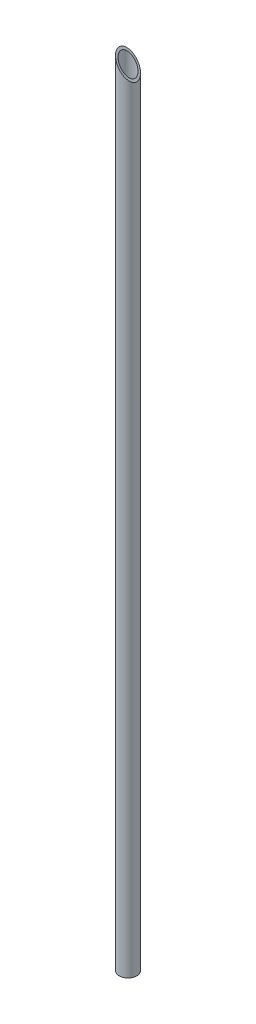
ISO-10303-21;
HEADER;
FILE_DESCRIPTION(('STEP AP214'),'2;1');
FILE_NAME('part.step','',(''),(''),'','','');
FILE_SCHEMA(('AUTOMOTIVE_DESIGN { 1 0 10303 214 1 1 1 1 }'));
ENDSEC;
DATA;
#1=APPLICATION_CONTEXT('core data for automotive mechanical design processes');
#2=APPLICATION_PROTOCOL_DEFINITION('international standard','automotive_design',2000,#1);
#3=PRODUCT_CONTEXT('',#1,'mechanical');
#4=PRODUCT('Part','Part','',(#3));
#5=PRODUCT_RELATED_PRODUCT_CATEGORY('part','',(#4));
#6=PRODUCT_DEFINITION_FORMATION('','',#4);
#7=PRODUCT_DEFINITION_CONTEXT('part definition',#1,'design');
#8=PRODUCT_DEFINITION('design','',#6,#7);
#9=PRODUCT_DEFINITION_SHAPE('','',#8);
#10=(LENGTH_UNIT() NAMED_UNIT(*) SI_UNIT(.MILLI.,.METRE.));
#11=(NAMED_UNIT(*) PLANE_ANGLE_UNIT() SI_UNIT($,.RADIAN.));
#12=(NAMED_UNIT(*) SI_UNIT($,.STERADIAN.) SOLID_ANGLE_UNIT());
#13=UNCERTAINTY_MEASURE_WITH_UNIT(LENGTH_MEASURE(1.E-05),#10,'distance_accuracy_value','');
#14=(GEOMETRIC_REPRESENTATION_CONTEXT(3) GLOBAL_UNCERTAINTY_ASSIGNED_CONTEXT((#13)) GLOBAL_UNIT_ASSIGNED_CONTEXT((#10,
#11,#12)) REPRESENTATION_CONTEXT('',''));
#15=CARTESIAN_POINT('',(0.,0.,0.));
#16=DIRECTION('',(0.,0.,1.));
#17=DIRECTION('',(1.,0.,0.));
#18=AXIS2_PLACEMENT_3D('',#15,#16,#17);
#19=CARTESIAN_POINT('',(0.,45.,0.));
#20=DIRECTION('',(0.,-1.,0.));
#21=DIRECTION('',(0.,0.,-1.));
#22=AXIS2_PLACEMENT_3D('',#19,#20,#21);
#23=CYLINDRICAL_SURFACE('',#22,0.5);
#24=CARTESIAN_POINT('',(0.,44.3907601933725,0.));
#25=DIRECTION('',(-0.77300434808648,-0.634400723391293,0.));
#26=DIRECTION('',(0.634400723391293,-0.77300434808648,0.));
#27=AXIS2_PLACEMENT_3D('',#24,#25,#26);
#28=ELLIPSE('',#27,0.78814538124605,0.5);
#29=CARTESIAN_POINT('',(0.5,43.7815203867451,0.));
#30=VERTEX_POINT('',#29);
#31=EDGE_CURVE('E45',#30,#30,#28,.T.);
#32=ORIENTED_EDGE('',*,*,#31,.T.);
#33=EDGE_LOOP('',(#32));
#34=FACE_BOUND('',#33,.T.);
#35=CARTESIAN_POINT('',(0.,0.,0.));
#36=DIRECTION('',(0.,1.,0.));
#37=DIRECTION('',(0.,0.,1.));
#38=AXIS2_PLACEMENT_3D('',#35,#36,#37);
#39=CIRCLE('',#38,0.5);
#40=CARTESIAN_POINT('',(0.,0.,0.5));
#41=VERTEX_POINT('',#40);
#42=EDGE_CURVE('E10',#41,#41,#39,.T.);
#43=ORIENTED_EDGE('',*,*,#42,.T.);
#44=EDGE_LOOP('',(#43));
#45=FACE_BOUND('',#44,.T.);
#46=ADVANCED_FACE('F34',(#34,#45),#23,.T.);
#47=CARTESIAN_POINT('',(0.,0.,0.));
#48=DIRECTION('',(0.,1.,0.));
#49=DIRECTION('',(0.,0.,1.));
#50=AXIS2_PLACEMENT_3D('',#47,#48,#49);
#51=PLANE('',#50);
#52=CARTESIAN_POINT('',(0.,0.,0.));
#53=DIRECTION('',(0.,1.,0.));
#54=DIRECTION('',(0.,0.,1.));
#55=AXIS2_PLACEMENT_3D('',#52,#53,#54);
#56=CIRCLE('',#55,0.4);
#57=CARTESIAN_POINT('',(0.,0.,0.4));
#58=VERTEX_POINT('',#57);
#59=EDGE_CURVE('E41',#58,#58,#56,.T.);
#60=ORIENTED_EDGE('',*,*,#59,.T.);
#61=EDGE_LOOP('',(#60));
#62=FACE_BOUND('',#61,.T.);
#63=ORIENTED_EDGE('',*,*,#42,.F.);
#64=EDGE_LOOP('',(#63));
#65=FACE_BOUND('',#64,.T.);
#66=ADVANCED_FACE('F60',(#62,#65),#51,.F.);
#67=CARTESIAN_POINT('',(0.,45.,0.));
#68=DIRECTION('',(0.,-1.,0.));
#69=DIRECTION('',(0.,0.,-1.));
#70=AXIS2_PLACEMENT_3D('',#67,#68,#69);
#71=CYLINDRICAL_SURFACE('',#70,0.4);
#72=CARTESIAN_POINT('',(0.,44.3907601933725,0.));
#73=DIRECTION('',(-0.77300434808648,-0.634400723391293,0.));
#74=DIRECTION('',(0.634400723391293,-0.77300434808648,0.));
#75=AXIS2_PLACEMENT_3D('',#72,#73,#74);
#76=ELLIPSE('',#75,0.63051630499684,0.4);
#77=CARTESIAN_POINT('',(0.4,43.9033683480706,0.));
#78=VERTEX_POINT('',#77);
#79=EDGE_CURVE('E37',#78,#78,#76,.T.);
#80=ORIENTED_EDGE('',*,*,#79,.F.);
#81=EDGE_LOOP('',(#80));
#82=FACE_BOUND('',#81,.T.);
#83=ORIENTED_EDGE('',*,*,#59,.F.);
#84=EDGE_LOOP('',(#83));
#85=FACE_BOUND('',#84,.T.);
#86=ADVANCED_FACE('F57',(#82,#85),#71,.F.);
#87=CARTESIAN_POINT('',(-0.5,45.,-45.));
#88=DIRECTION('',(-0.77300434808648,-0.634400723391293,0.));
#89=DIRECTION('',(0.634400723391293,-0.77300434808648,0.));
#90=AXIS2_PLACEMENT_3D('',#87,#88,#89);
#91=PLANE('',#90);
#92=ORIENTED_EDGE('',*,*,#79,.T.);
#93=EDGE_LOOP('',(#92));
#94=FACE_BOUND('',#93,.T.);
#95=ORIENTED_EDGE('',*,*,#31,.F.);
#96=EDGE_LOOP('',(#95));
#97=FACE_BOUND('',#96,.T.);
#98=ADVANCED_FACE('F54',(#94,#97),#91,.F.);
#99=CLOSED_SHELL('',(#46,#66,#86,#98));
#100=MANIFOLD_SOLID_BREP('B2',#99);
#101=ADVANCED_BREP_SHAPE_REPRESENTATION('',(#18,#100),#14);
#102=SHAPE_DEFINITION_REPRESENTATION(#9,#101);
ENDSEC;
END-ISO-10303-21;
